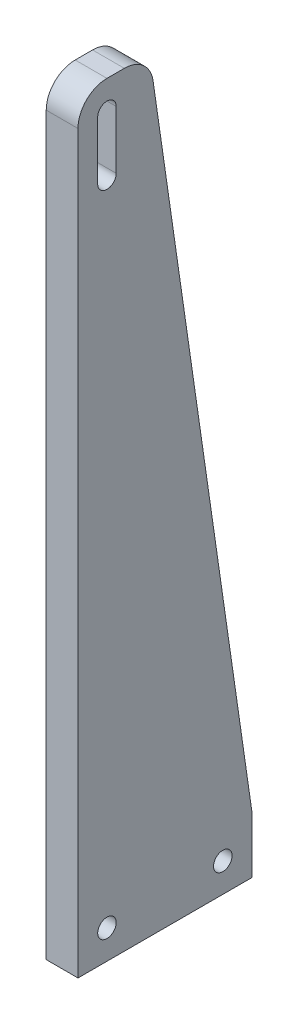
ISO-10303-21;
HEADER;
FILE_DESCRIPTION(('STEP AP214'),'2;1');
FILE_NAME('part.step','',(''),(''),'','','');
FILE_SCHEMA(('AUTOMOTIVE_DESIGN { 1 0 10303 214 1 1 1 1 }'));
ENDSEC;
DATA;
#1=APPLICATION_CONTEXT('core data for automotive mechanical design processes');
#2=APPLICATION_PROTOCOL_DEFINITION('international standard','automotive_design',2000,#1);
#3=PRODUCT_CONTEXT('',#1,'mechanical');
#4=PRODUCT('Part','Part','',(#3));
#5=PRODUCT_RELATED_PRODUCT_CATEGORY('part','',(#4));
#6=PRODUCT_DEFINITION_FORMATION('','',#4);
#7=PRODUCT_DEFINITION_CONTEXT('part definition',#1,'design');
#8=PRODUCT_DEFINITION('design','',#6,#7);
#9=PRODUCT_DEFINITION_SHAPE('','',#8);
#10=(LENGTH_UNIT() NAMED_UNIT(*) SI_UNIT(.MILLI.,.METRE.));
#11=(NAMED_UNIT(*) PLANE_ANGLE_UNIT() SI_UNIT($,.RADIAN.));
#12=(NAMED_UNIT(*) SI_UNIT($,.STERADIAN.) SOLID_ANGLE_UNIT());
#13=UNCERTAINTY_MEASURE_WITH_UNIT(LENGTH_MEASURE(1.E-05),#10,'distance_accuracy_value','');
#14=(GEOMETRIC_REPRESENTATION_CONTEXT(3) GLOBAL_UNCERTAINTY_ASSIGNED_CONTEXT((#13)) GLOBAL_UNIT_ASSIGNED_CONTEXT((#10,
#11,#12)) REPRESENTATION_CONTEXT('',''));
#15=CARTESIAN_POINT('',(0.,0.,0.));
#16=DIRECTION('',(0.,0.,1.));
#17=DIRECTION('',(1.,0.,0.));
#18=AXIS2_PLACEMENT_3D('',#15,#16,#17);
#19=CARTESIAN_POINT('',(5.4864,127.,-5.00000000000001));
#20=DIRECTION('',(-1.,0.,0.));
#21=DIRECTION('',(0.,0.,1.));
#22=AXIS2_PLACEMENT_3D('',#19,#20,#21);
#23=PLANE('',#22);
#24=DIRECTION('',(0.,-1.,0.));
#25=VECTOR('',#24,1.);
#26=CARTESIAN_POINT('',(5.4864,0.,0.));
#27=LINE('',#26,#25);
#28=CARTESIAN_POINT('',(5.4864,127.,0.));
#29=VERTEX_POINT('',#28);
#30=CARTESIAN_POINT('',(5.4864,0.,0.));
#31=VERTEX_POINT('',#30);
#32=EDGE_CURVE('E155',#29,#31,#27,.T.);
#33=ORIENTED_EDGE('',*,*,#32,.T.);
#34=DIRECTION('',(0.,0.,-1.));
#35=VECTOR('',#34,1.);
#36=CARTESIAN_POINT('',(5.4864,0.,0.));
#37=LINE('',#36,#35);
#38=CARTESIAN_POINT('',(5.4864,0.,-30.));
#39=VERTEX_POINT('',#38);
#40=EDGE_CURVE('E158',#31,#39,#37,.T.);
#41=ORIENTED_EDGE('',*,*,#40,.T.);
#42=DIRECTION('',(0.,1.,0.));
#43=VECTOR('',#42,1.);
#44=CARTESIAN_POINT('',(5.4864,0.,-30.));
#45=LINE('',#44,#43);
#46=CARTESIAN_POINT('',(5.4864,10.,-30.));
#47=VERTEX_POINT('',#46);
#48=EDGE_CURVE('E161',#39,#47,#45,.T.);
#49=ORIENTED_EDGE('',*,*,#48,.T.);
#50=DIRECTION('',(0.,0.989671048918543,0.143356949369298));
#51=VECTOR('',#50,1.);
#52=CARTESIAN_POINT('',(5.4864,10.,-30.));
#53=LINE('',#52,#51);
#54=CARTESIAN_POINT('',(5.4864,127.716784746846,-12.9483552445927));
#55=VERTEX_POINT('',#54);
#56=EDGE_CURVE('E163',#47,#55,#53,.T.);
#57=ORIENTED_EDGE('',*,*,#56,.T.);
#58=CARTESIAN_POINT('',(5.4864,127.,-8.00000000000001));
#59=DIRECTION('',(1.,0.,0.));
#60=DIRECTION('',(0.,0.,1.));
#61=AXIS2_PLACEMENT_3D('',#58,#59,#60);
#62=CIRCLE('',#61,5.00000000000001);
#63=CARTESIAN_POINT('',(5.4864,132.,-8.00000000000001));
#64=VERTEX_POINT('',#63);
#65=EDGE_CURVE('E165',#55,#64,#62,.T.);
#66=ORIENTED_EDGE('',*,*,#65,.T.);
#67=DIRECTION('',(0.,0.,1.));
#68=VECTOR('',#67,1.);
#69=CARTESIAN_POINT('',(5.4864,132.,-5.00000000000001));
#70=LINE('',#69,#68);
#71=CARTESIAN_POINT('',(5.4864,132.,-5.00000000000001));
#72=VERTEX_POINT('',#71);
#73=EDGE_CURVE('E167',#64,#72,#70,.T.);
#74=ORIENTED_EDGE('',*,*,#73,.T.);
#75=CARTESIAN_POINT('',(5.4864,127.,-5.00000000000001));
#76=DIRECTION('',(1.,0.,0.));
#77=DIRECTION('',(0.,0.,1.));
#78=AXIS2_PLACEMENT_3D('',#75,#76,#77);
#79=CIRCLE('',#78,5.);
#80=EDGE_CURVE('E169',#72,#29,#79,.T.);
#81=ORIENTED_EDGE('',*,*,#80,.T.);
#82=EDGE_LOOP('',(#33,#41,#49,#57,#66,#74,#81));
#83=FACE_BOUND('',#82,.T.);
#84=CARTESIAN_POINT('',(5.4864,117.,-5.00000000000001));
#85=DIRECTION('',(1.,0.,0.));
#86=DIRECTION('',(0.,0.,-1.));
#87=AXIS2_PLACEMENT_3D('',#84,#85,#86);
#88=CIRCLE('',#87,1.6);
#89=CARTESIAN_POINT('',(5.4864,117.,-3.40000000000001));
#90=VERTEX_POINT('',#89);
#91=CARTESIAN_POINT('',(5.4864,117.,-6.60000000000001));
#92=VERTEX_POINT('',#91);
#93=EDGE_CURVE('E116',#90,#92,#88,.T.);
#94=ORIENTED_EDGE('',*,*,#93,.F.);
#95=DIRECTION('',(0.,-1.,0.));
#96=VECTOR('',#95,1.);
#97=CARTESIAN_POINT('',(5.4864,117.,-3.40000000000001));
#98=LINE('',#97,#96);
#99=CARTESIAN_POINT('',(5.4864,127.,-3.40000000000001));
#100=VERTEX_POINT('',#99);
#101=EDGE_CURVE('E139',#100,#90,#98,.T.);
#102=ORIENTED_EDGE('',*,*,#101,.F.);
#103=CARTESIAN_POINT('',(5.4864,127.,-5.00000000000001));
#104=DIRECTION('',(1.,0.,0.));
#105=DIRECTION('',(0.,0.,-1.));
#106=AXIS2_PLACEMENT_3D('',#103,#104,#105);
#107=CIRCLE('',#106,1.6);
#108=CARTESIAN_POINT('',(5.4864,127.,-6.6));
#109=VERTEX_POINT('',#108);
#110=EDGE_CURVE('E137',#109,#100,#107,.T.);
#111=ORIENTED_EDGE('',*,*,#110,.F.);
#112=DIRECTION('',(0.,1.,0.));
#113=VECTOR('',#112,1.);
#114=CARTESIAN_POINT('',(5.4864,117.,-6.60000000000001));
#115=LINE('',#114,#113);
#116=EDGE_CURVE('E124',#92,#109,#115,.T.);
#117=ORIENTED_EDGE('',*,*,#116,.F.);
#118=EDGE_LOOP('',(#94,#102,#111,#117));
#119=FACE_BOUND('',#118,.T.);
#120=CARTESIAN_POINT('',(5.4864,5.,-5.));
#121=DIRECTION('',(1.,0.,0.));
#122=DIRECTION('',(0.,0.,-1.));
#123=AXIS2_PLACEMENT_3D('',#120,#121,#122);
#124=CIRCLE('',#123,1.6);
#125=CARTESIAN_POINT('',(5.4864,5.,-6.6));
#126=VERTEX_POINT('',#125);
#127=EDGE_CURVE('E145',#126,#126,#124,.T.);
#128=ORIENTED_EDGE('',*,*,#127,.F.);
#129=EDGE_LOOP('',(#128));
#130=FACE_BOUND('',#129,.T.);
#131=CARTESIAN_POINT('',(5.4864,5.,-25.));
#132=DIRECTION('',(1.,0.,0.));
#133=DIRECTION('',(0.,0.,-1.));
#134=AXIS2_PLACEMENT_3D('',#131,#132,#133);
#135=CIRCLE('',#134,1.6);
#136=CARTESIAN_POINT('',(5.4864,5.,-26.6));
#137=VERTEX_POINT('',#136);
#138=EDGE_CURVE('E274',#137,#137,#135,.T.);
#139=ORIENTED_EDGE('',*,*,#138,.F.);
#140=EDGE_LOOP('',(#139));
#141=FACE_BOUND('',#140,.T.);
#142=ADVANCED_FACE('F33',(#83,#119,#130,#141),#23,.F.);
#143=CARTESIAN_POINT('',(0.,127.,-5.00000000000001));
#144=DIRECTION('',(-1.,0.,0.));
#145=DIRECTION('',(0.,0.,1.));
#146=AXIS2_PLACEMENT_3D('',#143,#144,#145);
#147=PLANE('',#146);
#148=CARTESIAN_POINT('',(0.,5.,-5.));
#149=DIRECTION('',(1.,0.,0.));
#150=DIRECTION('',(0.,0.,-1.));
#151=AXIS2_PLACEMENT_3D('',#148,#149,#150);
#152=CIRCLE('',#151,1.6);
#153=CARTESIAN_POINT('',(0.,5.,-6.6));
#154=VERTEX_POINT('',#153);
#155=EDGE_CURVE('E280',#154,#154,#152,.T.);
#156=ORIENTED_EDGE('',*,*,#155,.T.);
#157=EDGE_LOOP('',(#156));
#158=FACE_BOUND('',#157,.T.);
#159=DIRECTION('',(0.,-1.,0.));
#160=VECTOR('',#159,1.);
#161=CARTESIAN_POINT('',(0.,0.,0.));
#162=LINE('',#161,#160);
#163=CARTESIAN_POINT('',(0.,127.,0.));
#164=VERTEX_POINT('',#163);
#165=CARTESIAN_POINT('',(0.,0.,0.));
#166=VERTEX_POINT('',#165);
#167=EDGE_CURVE('E132',#164,#166,#162,.T.);
#168=ORIENTED_EDGE('',*,*,#167,.F.);
#169=CARTESIAN_POINT('',(0.,127.,-5.00000000000001));
#170=DIRECTION('',(1.,0.,0.));
#171=DIRECTION('',(0.,0.,1.));
#172=AXIS2_PLACEMENT_3D('',#169,#170,#171);
#173=CIRCLE('',#172,5.);
#174=CARTESIAN_POINT('',(0.,132.,-5.00000000000001));
#175=VERTEX_POINT('',#174);
#176=EDGE_CURVE('E159',#175,#164,#173,.T.);
#177=ORIENTED_EDGE('',*,*,#176,.F.);
#178=DIRECTION('',(0.,0.,1.));
#179=VECTOR('',#178,1.);
#180=CARTESIAN_POINT('',(0.,132.,-5.00000000000001));
#181=LINE('',#180,#179);
#182=CARTESIAN_POINT('',(0.,132.,-8.00000000000001));
#183=VERTEX_POINT('',#182);
#184=EDGE_CURVE('E182',#183,#175,#181,.T.);
#185=ORIENTED_EDGE('',*,*,#184,.F.);
#186=CARTESIAN_POINT('',(0.,127.,-8.00000000000001));
#187=DIRECTION('',(1.,0.,0.));
#188=DIRECTION('',(0.,0.,1.));
#189=AXIS2_PLACEMENT_3D('',#186,#187,#188);
#190=CIRCLE('',#189,5.00000000000001);
#191=CARTESIAN_POINT('',(0.,127.716784746846,-12.9483552445927));
#192=VERTEX_POINT('',#191);
#193=EDGE_CURVE('E180',#192,#183,#190,.T.);
#194=ORIENTED_EDGE('',*,*,#193,.F.);
#195=DIRECTION('',(0.,0.989671048918543,0.143356949369298));
#196=VECTOR('',#195,1.);
#197=CARTESIAN_POINT('',(0.,10.,-30.));
#198=LINE('',#197,#196);
#199=CARTESIAN_POINT('',(0.,10.,-30.));
#200=VERTEX_POINT('',#199);
#201=EDGE_CURVE('E178',#200,#192,#198,.T.);
#202=ORIENTED_EDGE('',*,*,#201,.F.);
#203=DIRECTION('',(0.,1.,0.));
#204=VECTOR('',#203,1.);
#205=CARTESIAN_POINT('',(0.,0.,-30.));
#206=LINE('',#205,#204);
#207=CARTESIAN_POINT('',(0.,0.,-30.));
#208=VERTEX_POINT('',#207);
#209=EDGE_CURVE('E176',#208,#200,#206,.T.);
#210=ORIENTED_EDGE('',*,*,#209,.F.);
#211=DIRECTION('',(0.,0.,-1.));
#212=VECTOR('',#211,1.);
#213=CARTESIAN_POINT('',(0.,0.,0.));
#214=LINE('',#213,#212);
#215=EDGE_CURVE('E174',#166,#208,#214,.T.);
#216=ORIENTED_EDGE('',*,*,#215,.F.);
#217=EDGE_LOOP('',(#168,#177,#185,#194,#202,#210,#216));
#218=FACE_BOUND('',#217,.T.);
#219=DIRECTION('',(0.,-1.,0.));
#220=VECTOR('',#219,1.);
#221=CARTESIAN_POINT('',(0.,117.,-3.40000000000001));
#222=LINE('',#221,#220);
#223=CARTESIAN_POINT('',(0.,127.,-3.40000000000001));
#224=VERTEX_POINT('',#223);
#225=CARTESIAN_POINT('',(0.,117.,-3.40000000000001));
#226=VERTEX_POINT('',#225);
#227=EDGE_CURVE('E125',#224,#226,#222,.T.);
#228=ORIENTED_EDGE('',*,*,#227,.T.);
#229=CARTESIAN_POINT('',(0.,117.,-5.00000000000001));
#230=DIRECTION('',(1.,0.,0.));
#231=DIRECTION('',(0.,0.,-1.));
#232=AXIS2_PLACEMENT_3D('',#229,#230,#231);
#233=CIRCLE('',#232,1.6);
#234=CARTESIAN_POINT('',(0.,117.,-6.60000000000001));
#235=VERTEX_POINT('',#234);
#236=EDGE_CURVE('E56',#226,#235,#233,.T.);
#237=ORIENTED_EDGE('',*,*,#236,.T.);
#238=DIRECTION('',(0.,1.,0.));
#239=VECTOR('',#238,1.);
#240=CARTESIAN_POINT('',(0.,117.,-6.60000000000001));
#241=LINE('',#240,#239);
#242=CARTESIAN_POINT('',(0.,127.,-6.6));
#243=VERTEX_POINT('',#242);
#244=EDGE_CURVE('E131',#235,#243,#241,.T.);
#245=ORIENTED_EDGE('',*,*,#244,.T.);
#246=CARTESIAN_POINT('',(0.,127.,-5.00000000000001));
#247=DIRECTION('',(1.,0.,0.));
#248=DIRECTION('',(0.,0.,-1.));
#249=AXIS2_PLACEMENT_3D('',#246,#247,#248);
#250=CIRCLE('',#249,1.6);
#251=EDGE_CURVE('E147',#243,#224,#250,.T.);
#252=ORIENTED_EDGE('',*,*,#251,.T.);
#253=EDGE_LOOP('',(#228,#237,#245,#252));
#254=FACE_BOUND('',#253,.T.);
#255=CARTESIAN_POINT('',(0.,5.,-25.));
#256=DIRECTION('',(1.,0.,0.));
#257=DIRECTION('',(0.,0.,-1.));
#258=AXIS2_PLACEMENT_3D('',#255,#256,#257);
#259=CIRCLE('',#258,1.6);
#260=CARTESIAN_POINT('',(0.,5.,-26.6));
#261=VERTEX_POINT('',#260);
#262=EDGE_CURVE('E277',#261,#261,#259,.T.);
#263=ORIENTED_EDGE('',*,*,#262,.T.);
#264=EDGE_LOOP('',(#263));
#265=FACE_BOUND('',#264,.T.);
#266=ADVANCED_FACE('F209',(#158,#218,#254,#265),#147,.T.);
#267=CARTESIAN_POINT('',(5.4864,0.,0.));
#268=DIRECTION('',(0.,0.,-1.));
#269=DIRECTION('',(-1.,0.,0.));
#270=AXIS2_PLACEMENT_3D('',#267,#268,#269);
#271=PLANE('',#270);
#272=ORIENTED_EDGE('',*,*,#167,.T.);
#273=DIRECTION('',(-1.,0.,0.));
#274=VECTOR('',#273,1.);
#275=CARTESIAN_POINT('',(5.4864,0.,0.));
#276=LINE('',#275,#274);
#277=EDGE_CURVE('E11',#31,#166,#276,.T.);
#278=ORIENTED_EDGE('',*,*,#277,.F.);
#279=ORIENTED_EDGE('',*,*,#32,.F.);
#280=DIRECTION('',(-1.,0.,0.));
#281=VECTOR('',#280,1.);
#282=CARTESIAN_POINT('',(5.4864,127.,0.));
#283=LINE('',#282,#281);
#284=EDGE_CURVE('E171',#29,#164,#283,.T.);
#285=ORIENTED_EDGE('',*,*,#284,.T.);
#286=EDGE_LOOP('',(#272,#278,#279,#285));
#287=FACE_BOUND('',#286,.T.);
#288=ADVANCED_FACE('F35',(#287),#271,.F.);
#289=CARTESIAN_POINT('',(5.4864,0.,0.));
#290=DIRECTION('',(0.,1.,0.));
#291=DIRECTION('',(0.,0.,1.));
#292=AXIS2_PLACEMENT_3D('',#289,#290,#291);
#293=PLANE('',#292);
#294=ORIENTED_EDGE('',*,*,#215,.T.);
#295=DIRECTION('',(-1.,0.,0.));
#296=VECTOR('',#295,1.);
#297=CARTESIAN_POINT('',(5.4864,0.,-30.));
#298=LINE('',#297,#296);
#299=EDGE_CURVE('E41',#39,#208,#298,.T.);
#300=ORIENTED_EDGE('',*,*,#299,.F.);
#301=ORIENTED_EDGE('',*,*,#40,.F.);
#302=ORIENTED_EDGE('',*,*,#277,.T.);
#303=EDGE_LOOP('',(#294,#300,#301,#302));
#304=FACE_BOUND('',#303,.T.);
#305=ADVANCED_FACE('F226',(#304),#293,.F.);
#306=CARTESIAN_POINT('',(5.4864,0.,-30.));
#307=DIRECTION('',(0.,0.,1.));
#308=DIRECTION('',(1.,0.,0.));
#309=AXIS2_PLACEMENT_3D('',#306,#307,#308);
#310=PLANE('',#309);
#311=ORIENTED_EDGE('',*,*,#209,.T.);
#312=DIRECTION('',(-1.,0.,0.));
#313=VECTOR('',#312,1.);
#314=CARTESIAN_POINT('',(5.4864,10.,-30.));
#315=LINE('',#314,#313);
#316=EDGE_CURVE('E196',#47,#200,#315,.T.);
#317=ORIENTED_EDGE('',*,*,#316,.F.);
#318=ORIENTED_EDGE('',*,*,#48,.F.);
#319=ORIENTED_EDGE('',*,*,#299,.T.);
#320=EDGE_LOOP('',(#311,#317,#318,#319));
#321=FACE_BOUND('',#320,.T.);
#322=ADVANCED_FACE('F203',(#321),#310,.F.);
#323=CARTESIAN_POINT('',(5.4864,10.,-30.));
#324=DIRECTION('',(0.,-0.143356949369298,0.989671048918543));
#325=DIRECTION('',(0.,-0.989671048918543,-0.143356949369298));
#326=AXIS2_PLACEMENT_3D('',#323,#324,#325);
#327=PLANE('',#326);
#328=ORIENTED_EDGE('',*,*,#201,.T.);
#329=DIRECTION('',(-1.,0.,0.));
#330=VECTOR('',#329,1.);
#331=CARTESIAN_POINT('',(5.4864,127.716784746846,-12.9483552445927));
#332=LINE('',#331,#330);
#333=EDGE_CURVE('E193',#55,#192,#332,.T.);
#334=ORIENTED_EDGE('',*,*,#333,.F.);
#335=ORIENTED_EDGE('',*,*,#56,.F.);
#336=ORIENTED_EDGE('',*,*,#316,.T.);
#337=EDGE_LOOP('',(#328,#334,#335,#336));
#338=FACE_BOUND('',#337,.T.);
#339=ADVANCED_FACE('F215',(#338),#327,.F.);
#340=CARTESIAN_POINT('',(5.4864,127.,-8.00000000000001));
#341=DIRECTION('',(-1.,0.,0.));
#342=DIRECTION('',(0.,0.,1.));
#343=AXIS2_PLACEMENT_3D('',#340,#341,#342);
#344=CYLINDRICAL_SURFACE('',#343,5.00000000000001);
#345=ORIENTED_EDGE('',*,*,#193,.T.);
#346=DIRECTION('',(-1.,0.,0.));
#347=VECTOR('',#346,1.);
#348=CARTESIAN_POINT('',(5.4864,132.,-8.00000000000001));
#349=LINE('',#348,#347);
#350=EDGE_CURVE('E190',#64,#183,#349,.T.);
#351=ORIENTED_EDGE('',*,*,#350,.F.);
#352=ORIENTED_EDGE('',*,*,#65,.F.);
#353=ORIENTED_EDGE('',*,*,#333,.T.);
#354=EDGE_LOOP('',(#345,#351,#352,#353));
#355=FACE_BOUND('',#354,.T.);
#356=ADVANCED_FACE('F219',(#355),#344,.T.);
#357=CARTESIAN_POINT('',(5.4864,132.,-5.00000000000001));
#358=DIRECTION('',(0.,-1.,0.));
#359=DIRECTION('',(0.,0.,-1.));
#360=AXIS2_PLACEMENT_3D('',#357,#358,#359);
#361=PLANE('',#360);
#362=ORIENTED_EDGE('',*,*,#184,.T.);
#363=DIRECTION('',(-1.,0.,0.));
#364=VECTOR('',#363,1.);
#365=CARTESIAN_POINT('',(5.4864,132.,-5.00000000000001));
#366=LINE('',#365,#364);
#367=EDGE_CURVE('E187',#72,#175,#366,.T.);
#368=ORIENTED_EDGE('',*,*,#367,.F.);
#369=ORIENTED_EDGE('',*,*,#73,.F.);
#370=ORIENTED_EDGE('',*,*,#350,.T.);
#371=EDGE_LOOP('',(#362,#368,#369,#370));
#372=FACE_BOUND('',#371,.T.);
#373=ADVANCED_FACE('F234',(#372),#361,.F.);
#374=CARTESIAN_POINT('',(5.4864,127.,-5.00000000000001));
#375=DIRECTION('',(-1.,0.,0.));
#376=DIRECTION('',(0.,0.,1.));
#377=AXIS2_PLACEMENT_3D('',#374,#375,#376);
#378=CYLINDRICAL_SURFACE('',#377,5.);
#379=ORIENTED_EDGE('',*,*,#176,.T.);
#380=ORIENTED_EDGE('',*,*,#284,.F.);
#381=ORIENTED_EDGE('',*,*,#80,.F.);
#382=ORIENTED_EDGE('',*,*,#367,.T.);
#383=EDGE_LOOP('',(#379,#380,#381,#382));
#384=FACE_BOUND('',#383,.T.);
#385=ADVANCED_FACE('F231',(#384),#378,.T.);
#386=CARTESIAN_POINT('',(5.4864,117.,-5.00000000000001));
#387=DIRECTION('',(-1.,0.,0.));
#388=DIRECTION('',(0.,0.,1.));
#389=AXIS2_PLACEMENT_3D('',#386,#387,#388);
#390=CYLINDRICAL_SURFACE('',#389,1.6);
#391=ORIENTED_EDGE('',*,*,#236,.F.);
#392=DIRECTION('',(-1.,0.,0.));
#393=VECTOR('',#392,1.);
#394=CARTESIAN_POINT('',(5.4864,117.,-3.40000000000001));
#395=LINE('',#394,#393);
#396=EDGE_CURVE('E120',#90,#226,#395,.T.);
#397=ORIENTED_EDGE('',*,*,#396,.F.);
#398=ORIENTED_EDGE('',*,*,#93,.T.);
#399=DIRECTION('',(-1.,0.,0.));
#400=VECTOR('',#399,1.);
#401=CARTESIAN_POINT('',(5.4864,117.,-6.60000000000001));
#402=LINE('',#401,#400);
#403=EDGE_CURVE('E119',#92,#235,#402,.T.);
#404=ORIENTED_EDGE('',*,*,#403,.T.);
#405=EDGE_LOOP('',(#391,#397,#398,#404));
#406=FACE_BOUND('',#405,.T.);
#407=ADVANCED_FACE('F118',(#406),#390,.F.);
#408=CARTESIAN_POINT('',(5.4864,117.,-6.60000000000001));
#409=DIRECTION('',(0.,0.,1.));
#410=DIRECTION('',(0.,-1.,0.));
#411=AXIS2_PLACEMENT_3D('',#408,#409,#410);
#412=PLANE('',#411);
#413=ORIENTED_EDGE('',*,*,#244,.F.);
#414=ORIENTED_EDGE('',*,*,#403,.F.);
#415=ORIENTED_EDGE('',*,*,#116,.T.);
#416=DIRECTION('',(-1.,0.,0.));
#417=VECTOR('',#416,1.);
#418=CARTESIAN_POINT('',(5.4864,127.,-6.6));
#419=LINE('',#418,#417);
#420=EDGE_CURVE('E133',#109,#243,#419,.T.);
#421=ORIENTED_EDGE('',*,*,#420,.T.);
#422=EDGE_LOOP('',(#413,#414,#415,#421));
#423=FACE_BOUND('',#422,.T.);
#424=ADVANCED_FACE('F128',(#423),#412,.T.);
#425=CARTESIAN_POINT('',(5.4864,127.,-5.00000000000001));
#426=DIRECTION('',(-1.,0.,0.));
#427=DIRECTION('',(0.,0.,1.));
#428=AXIS2_PLACEMENT_3D('',#425,#426,#427);
#429=CYLINDRICAL_SURFACE('',#428,1.6);
#430=ORIENTED_EDGE('',*,*,#251,.F.);
#431=ORIENTED_EDGE('',*,*,#420,.F.);
#432=ORIENTED_EDGE('',*,*,#110,.T.);
#433=DIRECTION('',(-1.,0.,0.));
#434=VECTOR('',#433,1.);
#435=CARTESIAN_POINT('',(5.4864,127.,-3.40000000000001));
#436=LINE('',#435,#434);
#437=EDGE_CURVE('E48',#100,#224,#436,.T.);
#438=ORIENTED_EDGE('',*,*,#437,.T.);
#439=EDGE_LOOP('',(#430,#431,#432,#438));
#440=FACE_BOUND('',#439,.T.);
#441=ADVANCED_FACE('F255',(#440),#429,.F.);
#442=CARTESIAN_POINT('',(5.4864,117.,-3.40000000000001));
#443=DIRECTION('',(0.,0.,-1.));
#444=DIRECTION('',(0.,1.,0.));
#445=AXIS2_PLACEMENT_3D('',#442,#443,#444);
#446=PLANE('',#445);
#447=ORIENTED_EDGE('',*,*,#227,.F.);
#448=ORIENTED_EDGE('',*,*,#437,.F.);
#449=ORIENTED_EDGE('',*,*,#101,.T.);
#450=ORIENTED_EDGE('',*,*,#396,.T.);
#451=EDGE_LOOP('',(#447,#448,#449,#450));
#452=FACE_BOUND('',#451,.T.);
#453=ADVANCED_FACE('F258',(#452),#446,.T.);
#454=CARTESIAN_POINT('',(5.4864,5.,-5.));
#455=DIRECTION('',(-1.,0.,0.));
#456=DIRECTION('',(0.,0.,1.));
#457=AXIS2_PLACEMENT_3D('',#454,#455,#456);
#458=CYLINDRICAL_SURFACE('',#457,1.6);
#459=ORIENTED_EDGE('',*,*,#127,.T.);
#460=EDGE_LOOP('',(#459));
#461=FACE_BOUND('',#460,.T.);
#462=ORIENTED_EDGE('',*,*,#155,.F.);
#463=EDGE_LOOP('',(#462));
#464=FACE_BOUND('',#463,.T.);
#465=ADVANCED_FACE('F262',(#461,#464),#458,.F.);
#466=CARTESIAN_POINT('',(5.4864,5.,-25.));
#467=DIRECTION('',(-1.,0.,0.));
#468=DIRECTION('',(0.,0.,1.));
#469=AXIS2_PLACEMENT_3D('',#466,#467,#468);
#470=CYLINDRICAL_SURFACE('',#469,1.6);
#471=ORIENTED_EDGE('',*,*,#138,.T.);
#472=EDGE_LOOP('',(#471));
#473=FACE_BOUND('',#472,.T.);
#474=ORIENTED_EDGE('',*,*,#262,.F.);
#475=EDGE_LOOP('',(#474));
#476=FACE_BOUND('',#475,.T.);
#477=ADVANCED_FACE('F265',(#473,#476),#470,.F.);
#478=CLOSED_SHELL('',(#142,#266,#288,#305,#322,#339,#356,#373,#385,#407,#424,#441,#453,#465,#477));
#479=MANIFOLD_SOLID_BREP('B2',#478);
#480=ADVANCED_BREP_SHAPE_REPRESENTATION('',(#18,#479),#14);
#481=SHAPE_DEFINITION_REPRESENTATION(#9,#480);
ENDSEC;
END-ISO-10303-21;
